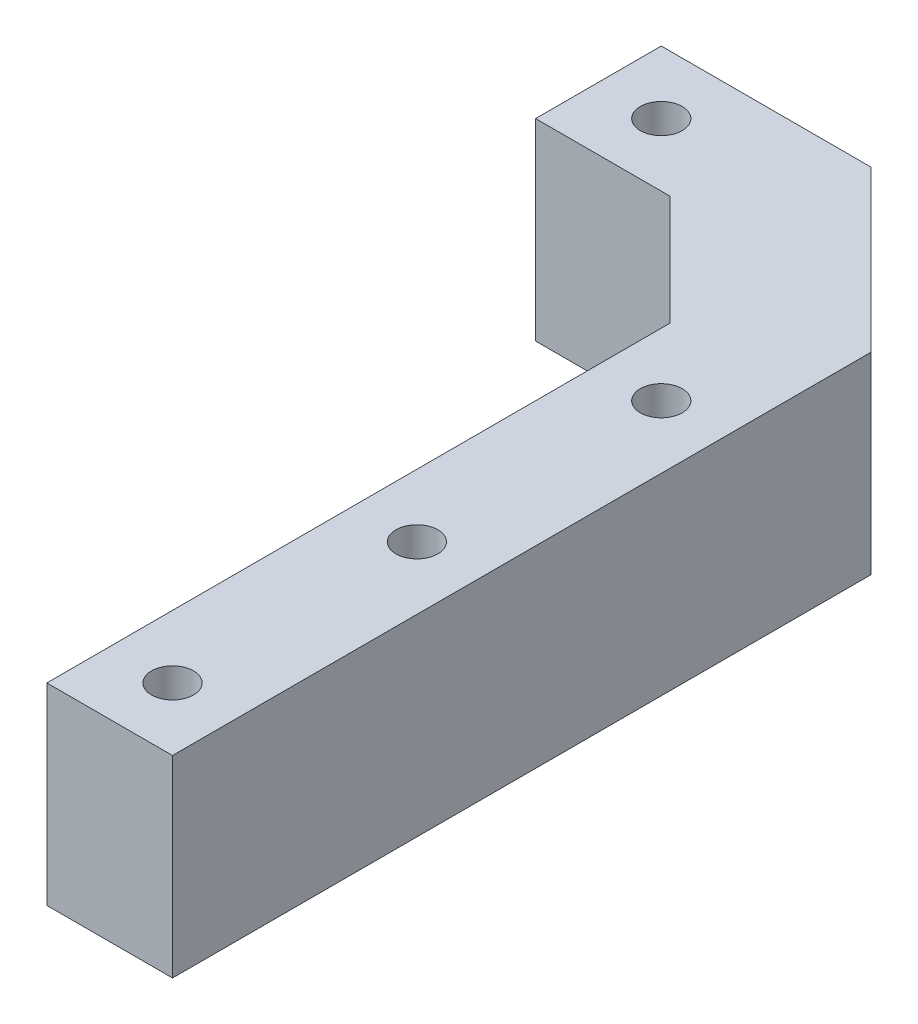
ISO-10303-21;
HEADER;
FILE_DESCRIPTION(('STEP AP214'),'2;1');
FILE_NAME('part.step','',(''),(''),'','','');
FILE_SCHEMA(('AUTOMOTIVE_DESIGN { 1 0 10303 214 1 1 1 1 }'));
ENDSEC;
DATA;
#1=APPLICATION_CONTEXT('core data for automotive mechanical design processes');
#2=APPLICATION_PROTOCOL_DEFINITION('international standard','automotive_design',2000,#1);
#3=PRODUCT_CONTEXT('',#1,'mechanical');
#4=PRODUCT('Part','Part','',(#3));
#5=PRODUCT_RELATED_PRODUCT_CATEGORY('part','',(#4));
#6=PRODUCT_DEFINITION_FORMATION('','',#4);
#7=PRODUCT_DEFINITION_CONTEXT('part definition',#1,'design');
#8=PRODUCT_DEFINITION('design','',#6,#7);
#9=PRODUCT_DEFINITION_SHAPE('','',#8);
#10=(LENGTH_UNIT() NAMED_UNIT(*) SI_UNIT(.MILLI.,.METRE.));
#11=(NAMED_UNIT(*) PLANE_ANGLE_UNIT() SI_UNIT($,.RADIAN.));
#12=(NAMED_UNIT(*) SI_UNIT($,.STERADIAN.) SOLID_ANGLE_UNIT());
#13=UNCERTAINTY_MEASURE_WITH_UNIT(LENGTH_MEASURE(1.E-05),#10,'distance_accuracy_value','');
#14=(GEOMETRIC_REPRESENTATION_CONTEXT(3) GLOBAL_UNCERTAINTY_ASSIGNED_CONTEXT((#13)) GLOBAL_UNIT_ASSIGNED_CONTEXT((#10,
#11,#12)) REPRESENTATION_CONTEXT('',''));
#15=CARTESIAN_POINT('',(0.,0.,0.));
#16=DIRECTION('',(0.,0.,1.));
#17=DIRECTION('',(1.,0.,0.));
#18=AXIS2_PLACEMENT_3D('',#15,#16,#17);
#19=CARTESIAN_POINT('',(0.,13.8,0.));
#20=DIRECTION('',(0.,1.,0.));
#21=DIRECTION('',(0.,0.,1.));
#22=AXIS2_PLACEMENT_3D('',#19,#20,#21);
#23=PLANE('',#22);
#24=CARTESIAN_POINT('',(-17.5,13.8,52.5));
#25=DIRECTION('',(0.,1.,0.));
#26=DIRECTION('',(0.,0.,1.));
#27=AXIS2_PLACEMENT_3D('',#24,#25,#26);
#28=CIRCLE('',#27,1.5);
#29=CARTESIAN_POINT('',(-17.5,13.8,51.));
#30=VERTEX_POINT('',#29);
#31=EDGE_CURVE('E196',#30,#30,#28,.T.);
#32=ORIENTED_EDGE('',*,*,#31,.F.);
#33=EDGE_LOOP('',(#32));
#34=FACE_BOUND('',#33,.T.);
#35=CARTESIAN_POINT('',(-35.,13.8,17.5));
#36=DIRECTION('',(0.,1.,0.));
#37=DIRECTION('',(0.,0.,1.));
#38=AXIS2_PLACEMENT_3D('',#35,#36,#37);
#39=CIRCLE('',#38,1.5);
#40=CARTESIAN_POINT('',(-35.,13.8,16.));
#41=VERTEX_POINT('',#40);
#42=EDGE_CURVE('E142',#41,#41,#39,.T.);
#43=ORIENTED_EDGE('',*,*,#42,.F.);
#44=EDGE_LOOP('',(#43));
#45=FACE_BOUND('',#44,.T.);
#46=DIRECTION('',(-1.,0.,0.));
#47=VECTOR('',#46,1.);
#48=CARTESIAN_POINT('',(-39.5,13.8,13.));
#49=LINE('',#48,#47);
#50=CARTESIAN_POINT('',(-24.4684752531343,13.8,13.));
#51=VERTEX_POINT('',#50);
#52=CARTESIAN_POINT('',(-39.5,13.8,13.));
#53=VERTEX_POINT('',#52);
#54=EDGE_CURVE('E154',#51,#53,#49,.T.);
#55=ORIENTED_EDGE('',*,*,#54,.T.);
#56=DIRECTION('',(0.,0.,1.));
#57=VECTOR('',#56,1.);
#58=CARTESIAN_POINT('',(-39.5,13.8,13.));
#59=LINE('',#58,#57);
#60=CARTESIAN_POINT('',(-39.5,13.8,22.));
#61=VERTEX_POINT('',#60);
#62=EDGE_CURVE('E100',#53,#61,#59,.T.);
#63=ORIENTED_EDGE('',*,*,#62,.T.);
#64=DIRECTION('',(1.,0.,0.));
#65=VECTOR('',#64,1.);
#66=CARTESIAN_POINT('',(-39.5,13.8,22.));
#67=LINE('',#66,#65);
#68=CARTESIAN_POINT('',(-29.8824055414627,13.8,22.));
#69=VERTEX_POINT('',#68);
#70=EDGE_CURVE('E169',#61,#69,#67,.T.);
#71=ORIENTED_EDGE('',*,*,#70,.T.);
#72=DIRECTION('',(0.707106781186547,0.,0.707106781186547));
#73=VECTOR('',#72,1.);
#74=CARTESIAN_POINT('',(-29.8824055414627,13.8,22.));
#75=LINE('',#74,#73);
#76=CARTESIAN_POINT('',(-22.,13.8,29.8824055414627));
#77=VERTEX_POINT('',#76);
#78=EDGE_CURVE('E181',#69,#77,#75,.T.);
#79=ORIENTED_EDGE('',*,*,#78,.T.);
#80=DIRECTION('',(0.,0.,1.));
#81=VECTOR('',#80,1.);
#82=CARTESIAN_POINT('',(-22.,13.8,29.8824055414627));
#83=LINE('',#82,#81);
#84=CARTESIAN_POINT('',(-22.,13.8,74.5));
#85=VERTEX_POINT('',#84);
#86=EDGE_CURVE('E119',#77,#85,#83,.T.);
#87=ORIENTED_EDGE('',*,*,#86,.T.);
#88=DIRECTION('',(1.,0.,0.));
#89=VECTOR('',#88,1.);
#90=CARTESIAN_POINT('',(-22.,13.8,74.5));
#91=LINE('',#90,#89);
#92=CARTESIAN_POINT('',(-13.,13.8,74.5));
#93=VERTEX_POINT('',#92);
#94=EDGE_CURVE('E113',#85,#93,#91,.T.);
#95=ORIENTED_EDGE('',*,*,#94,.T.);
#96=DIRECTION('',(0.,0.,-1.));
#97=VECTOR('',#96,1.);
#98=CARTESIAN_POINT('',(-13.,13.8,74.5));
#99=LINE('',#98,#97);
#100=CARTESIAN_POINT('',(-13.,13.8,24.4684752531343));
#101=VERTEX_POINT('',#100);
#102=EDGE_CURVE('E117',#93,#101,#99,.T.);
#103=ORIENTED_EDGE('',*,*,#102,.T.);
#104=DIRECTION('',(-0.707106781186547,0.,-0.707106781186548));
#105=VECTOR('',#104,1.);
#106=CARTESIAN_POINT('',(-13.,13.8,24.4684752531343));
#107=LINE('',#106,#105);
#108=EDGE_CURVE('E58',#101,#51,#107,.T.);
#109=ORIENTED_EDGE('',*,*,#108,.T.);
#110=EDGE_LOOP('',(#55,#63,#71,#79,#87,#95,#103,#109));
#111=FACE_BOUND('',#110,.T.);
#112=CARTESIAN_POINT('',(-17.5,13.8,35.));
#113=DIRECTION('',(0.,1.,0.));
#114=DIRECTION('',(0.,0.,1.));
#115=AXIS2_PLACEMENT_3D('',#112,#113,#114);
#116=CIRCLE('',#115,1.5);
#117=CARTESIAN_POINT('',(-17.5,13.8,33.5));
#118=VERTEX_POINT('',#117);
#119=EDGE_CURVE('E190',#118,#118,#116,.T.);
#120=ORIENTED_EDGE('',*,*,#119,.F.);
#121=EDGE_LOOP('',(#120));
#122=FACE_BOUND('',#121,.T.);
#123=CARTESIAN_POINT('',(-17.5,13.8,70.));
#124=DIRECTION('',(0.,1.,0.));
#125=DIRECTION('',(0.,0.,1.));
#126=AXIS2_PLACEMENT_3D('',#123,#124,#125);
#127=CIRCLE('',#126,1.5);
#128=CARTESIAN_POINT('',(-17.5,13.8,68.5));
#129=VERTEX_POINT('',#128);
#130=EDGE_CURVE('E202',#129,#129,#127,.T.);
#131=ORIENTED_EDGE('',*,*,#130,.F.);
#132=EDGE_LOOP('',(#131));
#133=FACE_BOUND('',#132,.T.);
#134=ADVANCED_FACE('F41',(#34,#45,#111,#122,#133),#23,.T.);
#135=CARTESIAN_POINT('',(0.,0.,0.));
#136=DIRECTION('',(0.,1.,0.));
#137=DIRECTION('',(0.,0.,1.));
#138=AXIS2_PLACEMENT_3D('',#135,#136,#137);
#139=PLANE('',#138);
#140=DIRECTION('',(-1.,0.,0.));
#141=VECTOR('',#140,1.);
#142=CARTESIAN_POINT('',(-39.5,0.,13.));
#143=LINE('',#142,#141);
#144=CARTESIAN_POINT('',(-24.4684752531343,0.,13.));
#145=VERTEX_POINT('',#144);
#146=CARTESIAN_POINT('',(-39.5,0.,13.));
#147=VERTEX_POINT('',#146);
#148=EDGE_CURVE('E138',#145,#147,#143,.T.);
#149=ORIENTED_EDGE('',*,*,#148,.F.);
#150=DIRECTION('',(-0.707106781186547,0.,-0.707106781186548));
#151=VECTOR('',#150,1.);
#152=CARTESIAN_POINT('',(-13.,0.,24.4684752531343));
#153=LINE('',#152,#151);
#154=CARTESIAN_POINT('',(-13.,0.,24.4684752531343));
#155=VERTEX_POINT('',#154);
#156=EDGE_CURVE('E92',#155,#145,#153,.T.);
#157=ORIENTED_EDGE('',*,*,#156,.F.);
#158=DIRECTION('',(0.,0.,-1.));
#159=VECTOR('',#158,1.);
#160=CARTESIAN_POINT('',(-13.,0.,37.5));
#161=LINE('',#160,#159);
#162=CARTESIAN_POINT('',(-13.,0.,74.5));
#163=VERTEX_POINT('',#162);
#164=EDGE_CURVE('E86',#163,#155,#161,.T.);
#165=ORIENTED_EDGE('',*,*,#164,.F.);
#166=DIRECTION('',(1.,0.,0.));
#167=VECTOR('',#166,1.);
#168=CARTESIAN_POINT('',(-22.,0.,74.5));
#169=LINE('',#168,#167);
#170=CARTESIAN_POINT('',(-22.,0.,74.5));
#171=VERTEX_POINT('',#170);
#172=EDGE_CURVE('E128',#171,#163,#169,.T.);
#173=ORIENTED_EDGE('',*,*,#172,.F.);
#174=DIRECTION('',(0.,0.,1.));
#175=VECTOR('',#174,1.);
#176=CARTESIAN_POINT('',(-22.,0.,37.5));
#177=LINE('',#176,#175);
#178=CARTESIAN_POINT('',(-22.,0.,29.8824055414627));
#179=VERTEX_POINT('',#178);
#180=EDGE_CURVE('E149',#179,#171,#177,.T.);
#181=ORIENTED_EDGE('',*,*,#180,.F.);
#182=DIRECTION('',(0.707106781186547,0.,0.707106781186547));
#183=VECTOR('',#182,1.);
#184=CARTESIAN_POINT('',(-29.8824055414627,0.,22.));
#185=LINE('',#184,#183);
#186=CARTESIAN_POINT('',(-29.8824055414627,0.,22.));
#187=VERTEX_POINT('',#186);
#188=EDGE_CURVE('E146',#187,#179,#185,.T.);
#189=ORIENTED_EDGE('',*,*,#188,.F.);
#190=DIRECTION('',(1.,0.,0.));
#191=VECTOR('',#190,1.);
#192=CARTESIAN_POINT('',(-39.5,0.,22.));
#193=LINE('',#192,#191);
#194=CARTESIAN_POINT('',(-39.5,0.,22.));
#195=VERTEX_POINT('',#194);
#196=EDGE_CURVE('E144',#195,#187,#193,.T.);
#197=ORIENTED_EDGE('',*,*,#196,.F.);
#198=DIRECTION('',(0.,0.,1.));
#199=VECTOR('',#198,1.);
#200=CARTESIAN_POINT('',(-39.5,0.,13.));
#201=LINE('',#200,#199);
#202=EDGE_CURVE('E141',#147,#195,#201,.T.);
#203=ORIENTED_EDGE('',*,*,#202,.F.);
#204=EDGE_LOOP('',(#149,#157,#165,#173,#181,#189,#197,#203));
#205=FACE_BOUND('',#204,.T.);
#206=CARTESIAN_POINT('',(-35.,0.,17.5));
#207=DIRECTION('',(0.,1.,0.));
#208=DIRECTION('',(0.,0.,1.));
#209=AXIS2_PLACEMENT_3D('',#206,#207,#208);
#210=CIRCLE('',#209,1.5);
#211=CARTESIAN_POINT('',(-35.,0.,16.));
#212=VERTEX_POINT('',#211);
#213=EDGE_CURVE('E187',#212,#212,#210,.T.);
#214=ORIENTED_EDGE('',*,*,#213,.T.);
#215=EDGE_LOOP('',(#214));
#216=FACE_BOUND('',#215,.T.);
#217=CARTESIAN_POINT('',(-17.5,0.,35.));
#218=DIRECTION('',(0.,1.,0.));
#219=DIRECTION('',(0.,0.,1.));
#220=AXIS2_PLACEMENT_3D('',#217,#218,#219);
#221=CIRCLE('',#220,1.5);
#222=CARTESIAN_POINT('',(-17.5,0.,33.5));
#223=VERTEX_POINT('',#222);
#224=EDGE_CURVE('E193',#223,#223,#221,.T.);
#225=ORIENTED_EDGE('',*,*,#224,.T.);
#226=EDGE_LOOP('',(#225));
#227=FACE_BOUND('',#226,.T.);
#228=CARTESIAN_POINT('',(-17.5,0.,52.5));
#229=DIRECTION('',(0.,1.,0.));
#230=DIRECTION('',(0.,0.,1.));
#231=AXIS2_PLACEMENT_3D('',#228,#229,#230);
#232=CIRCLE('',#231,1.5);
#233=CARTESIAN_POINT('',(-17.5,0.,51.));
#234=VERTEX_POINT('',#233);
#235=EDGE_CURVE('E199',#234,#234,#232,.T.);
#236=ORIENTED_EDGE('',*,*,#235,.T.);
#237=EDGE_LOOP('',(#236));
#238=FACE_BOUND('',#237,.T.);
#239=CARTESIAN_POINT('',(-17.5,0.,70.));
#240=DIRECTION('',(0.,1.,0.));
#241=DIRECTION('',(0.,0.,1.));
#242=AXIS2_PLACEMENT_3D('',#239,#240,#241);
#243=CIRCLE('',#242,1.5);
#244=CARTESIAN_POINT('',(-17.5,0.,68.5));
#245=VERTEX_POINT('',#244);
#246=EDGE_CURVE('E205',#245,#245,#243,.T.);
#247=ORIENTED_EDGE('',*,*,#246,.T.);
#248=EDGE_LOOP('',(#247));
#249=FACE_BOUND('',#248,.T.);
#250=ADVANCED_FACE('F173',(#205,#216,#227,#238,#249),#139,.F.);
#251=CARTESIAN_POINT('',(-39.5,13.8,13.));
#252=DIRECTION('',(0.,0.,1.));
#253=DIRECTION('',(1.,0.,0.));
#254=AXIS2_PLACEMENT_3D('',#251,#252,#253);
#255=PLANE('',#254);
#256=ORIENTED_EDGE('',*,*,#148,.T.);
#257=DIRECTION('',(0.,-1.,0.));
#258=VECTOR('',#257,1.);
#259=CARTESIAN_POINT('',(-39.5,13.8,13.));
#260=LINE('',#259,#258);
#261=EDGE_CURVE('E11',#53,#147,#260,.T.);
#262=ORIENTED_EDGE('',*,*,#261,.F.);
#263=ORIENTED_EDGE('',*,*,#54,.F.);
#264=DIRECTION('',(0.,-1.,0.));
#265=VECTOR('',#264,1.);
#266=CARTESIAN_POINT('',(-24.4684752531343,13.8,13.));
#267=LINE('',#266,#265);
#268=EDGE_CURVE('E134',#51,#145,#267,.T.);
#269=ORIENTED_EDGE('',*,*,#268,.T.);
#270=EDGE_LOOP('',(#256,#262,#263,#269));
#271=FACE_BOUND('',#270,.T.);
#272=ADVANCED_FACE('F43',(#271),#255,.F.);
#273=CARTESIAN_POINT('',(-39.5,13.8,13.));
#274=DIRECTION('',(1.,0.,0.));
#275=DIRECTION('',(0.,0.,-1.));
#276=AXIS2_PLACEMENT_3D('',#273,#274,#275);
#277=PLANE('',#276);
#278=ORIENTED_EDGE('',*,*,#202,.T.);
#279=DIRECTION('',(0.,-1.,0.));
#280=VECTOR('',#279,1.);
#281=CARTESIAN_POINT('',(-39.5,13.8,22.));
#282=LINE('',#281,#280);
#283=EDGE_CURVE('E50',#61,#195,#282,.T.);
#284=ORIENTED_EDGE('',*,*,#283,.F.);
#285=ORIENTED_EDGE('',*,*,#62,.F.);
#286=ORIENTED_EDGE('',*,*,#261,.T.);
#287=EDGE_LOOP('',(#278,#284,#285,#286));
#288=FACE_BOUND('',#287,.T.);
#289=ADVANCED_FACE('F239',(#288),#277,.F.);
#290=CARTESIAN_POINT('',(-39.5,13.8,22.));
#291=DIRECTION('',(0.,0.,-1.));
#292=DIRECTION('',(-1.,0.,0.));
#293=AXIS2_PLACEMENT_3D('',#290,#291,#292);
#294=PLANE('',#293);
#295=ORIENTED_EDGE('',*,*,#196,.T.);
#296=DIRECTION('',(0.,-1.,0.));
#297=VECTOR('',#296,1.);
#298=CARTESIAN_POINT('',(-29.8824055414627,13.8,22.));
#299=LINE('',#298,#297);
#300=EDGE_CURVE('E161',#69,#187,#299,.T.);
#301=ORIENTED_EDGE('',*,*,#300,.F.);
#302=ORIENTED_EDGE('',*,*,#70,.F.);
#303=ORIENTED_EDGE('',*,*,#283,.T.);
#304=EDGE_LOOP('',(#295,#301,#302,#303));
#305=FACE_BOUND('',#304,.T.);
#306=ADVANCED_FACE('F167',(#305),#294,.F.);
#307=CARTESIAN_POINT('',(-29.8824055414627,13.8,22.));
#308=DIRECTION('',(0.707106781186547,0.,-0.707106781186547));
#309=DIRECTION('',(-0.707106781186548,0.,-0.707106781186548));
#310=AXIS2_PLACEMENT_3D('',#307,#308,#309);
#311=PLANE('',#310);
#312=ORIENTED_EDGE('',*,*,#188,.T.);
#313=DIRECTION('',(0.,-1.,0.));
#314=VECTOR('',#313,1.);
#315=CARTESIAN_POINT('',(-22.,13.8,29.8824055414627));
#316=LINE('',#315,#314);
#317=EDGE_CURVE('E158',#77,#179,#316,.T.);
#318=ORIENTED_EDGE('',*,*,#317,.F.);
#319=ORIENTED_EDGE('',*,*,#78,.F.);
#320=ORIENTED_EDGE('',*,*,#300,.T.);
#321=EDGE_LOOP('',(#312,#318,#319,#320));
#322=FACE_BOUND('',#321,.T.);
#323=ADVANCED_FACE('F177',(#322),#311,.F.);
#324=CARTESIAN_POINT('',(-22.,13.8,37.5));
#325=DIRECTION('',(1.,0.,0.));
#326=DIRECTION('',(0.,0.,-1.));
#327=AXIS2_PLACEMENT_3D('',#324,#325,#326);
#328=PLANE('',#327);
#329=ORIENTED_EDGE('',*,*,#180,.T.);
#330=DIRECTION('',(0.,-1.,0.));
#331=VECTOR('',#330,1.);
#332=CARTESIAN_POINT('',(-22.,13.8,74.5));
#333=LINE('',#332,#331);
#334=EDGE_CURVE('E129',#85,#171,#333,.T.);
#335=ORIENTED_EDGE('',*,*,#334,.F.);
#336=ORIENTED_EDGE('',*,*,#86,.F.);
#337=ORIENTED_EDGE('',*,*,#317,.T.);
#338=EDGE_LOOP('',(#329,#335,#336,#337));
#339=FACE_BOUND('',#338,.T.);
#340=ADVANCED_FACE('F180',(#339),#328,.F.);
#341=CARTESIAN_POINT('',(-22.,13.8,74.5));
#342=DIRECTION('',(0.,0.,-1.));
#343=DIRECTION('',(-1.,0.,0.));
#344=AXIS2_PLACEMENT_3D('',#341,#342,#343);
#345=PLANE('',#344);
#346=ORIENTED_EDGE('',*,*,#172,.T.);
#347=DIRECTION('',(0.,-1.,0.));
#348=VECTOR('',#347,1.);
#349=CARTESIAN_POINT('',(-13.,13.8,74.5));
#350=LINE('',#349,#348);
#351=EDGE_CURVE('E125',#93,#163,#350,.T.);
#352=ORIENTED_EDGE('',*,*,#351,.F.);
#353=ORIENTED_EDGE('',*,*,#94,.F.);
#354=ORIENTED_EDGE('',*,*,#334,.T.);
#355=EDGE_LOOP('',(#346,#352,#353,#354));
#356=FACE_BOUND('',#355,.T.);
#357=ADVANCED_FACE('F126',(#356),#345,.F.);
#358=CARTESIAN_POINT('',(-13.,13.8,37.5));
#359=DIRECTION('',(-1.,0.,0.));
#360=DIRECTION('',(0.,0.,1.));
#361=AXIS2_PLACEMENT_3D('',#358,#359,#360);
#362=PLANE('',#361);
#363=ORIENTED_EDGE('',*,*,#164,.T.);
#364=DIRECTION('',(0.,-1.,0.));
#365=VECTOR('',#364,1.);
#366=CARTESIAN_POINT('',(-13.,13.8,24.4684752531343));
#367=LINE('',#366,#365);
#368=EDGE_CURVE('E130',#101,#155,#367,.T.);
#369=ORIENTED_EDGE('',*,*,#368,.F.);
#370=ORIENTED_EDGE('',*,*,#102,.F.);
#371=ORIENTED_EDGE('',*,*,#351,.T.);
#372=EDGE_LOOP('',(#363,#369,#370,#371));
#373=FACE_BOUND('',#372,.T.);
#374=ADVANCED_FACE('F132',(#373),#362,.F.);
#375=CARTESIAN_POINT('',(-13.,13.8,24.4684752531343));
#376=DIRECTION('',(-0.707106781186548,0.,0.707106781186547));
#377=DIRECTION('',(0.707106781186547,0.,0.707106781186548));
#378=AXIS2_PLACEMENT_3D('',#375,#376,#377);
#379=PLANE('',#378);
#380=ORIENTED_EDGE('',*,*,#156,.T.);
#381=ORIENTED_EDGE('',*,*,#268,.F.);
#382=ORIENTED_EDGE('',*,*,#108,.F.);
#383=ORIENTED_EDGE('',*,*,#368,.T.);
#384=EDGE_LOOP('',(#380,#381,#382,#383));
#385=FACE_BOUND('',#384,.T.);
#386=ADVANCED_FACE('F227',(#385),#379,.F.);
#387=CARTESIAN_POINT('',(-35.,13.8,17.5));
#388=DIRECTION('',(0.,-1.,0.));
#389=DIRECTION('',(0.,0.,-1.));
#390=AXIS2_PLACEMENT_3D('',#387,#388,#389);
#391=CYLINDRICAL_SURFACE('',#390,1.5);
#392=CARTESIAN_POINT('',(-35.,13.8,16.));
#393=CARTESIAN_POINT('',(-35.,13.65625,16.));
#394=CARTESIAN_POINT('',(-35.,13.5125,16.));
#395=CARTESIAN_POINT('',(-35.,13.225,16.));
#396=CARTESIAN_POINT('',(-35.,13.08125,16.));
#397=CARTESIAN_POINT('',(-35.,12.79375,16.));
#398=CARTESIAN_POINT('',(-35.,12.65,16.));
#399=CARTESIAN_POINT('',(-35.,12.3625,16.));
#400=CARTESIAN_POINT('',(-35.,12.21875,16.));
#401=CARTESIAN_POINT('',(-35.,11.93125,16.));
#402=CARTESIAN_POINT('',(-35.,11.7875,16.));
#403=CARTESIAN_POINT('',(-35.,11.5,16.));
#404=CARTESIAN_POINT('',(-35.,11.35625,16.));
#405=CARTESIAN_POINT('',(-35.,11.06875,16.));
#406=CARTESIAN_POINT('',(-35.,10.925,16.));
#407=CARTESIAN_POINT('',(-35.,10.6375,16.));
#408=CARTESIAN_POINT('',(-35.,10.49375,16.));
#409=CARTESIAN_POINT('',(-35.,10.20625,16.));
#410=CARTESIAN_POINT('',(-35.,10.0625,16.));
#411=CARTESIAN_POINT('',(-35.,9.775,16.));
#412=CARTESIAN_POINT('',(-35.,9.63125,16.));
#413=CARTESIAN_POINT('',(-35.,9.34375,16.));
#414=CARTESIAN_POINT('',(-35.,9.2,16.));
#415=CARTESIAN_POINT('',(-35.,8.9125,16.));
#416=CARTESIAN_POINT('',(-35.,8.76875,16.));
#417=CARTESIAN_POINT('',(-35.,8.48125,16.));
#418=CARTESIAN_POINT('',(-35.,8.3375,16.));
#419=CARTESIAN_POINT('',(-35.,8.05,16.));
#420=CARTESIAN_POINT('',(-35.,7.90625,16.));
#421=CARTESIAN_POINT('',(-35.,7.61875,16.));
#422=CARTESIAN_POINT('',(-35.,7.475,16.));
#423=CARTESIAN_POINT('',(-35.,7.1875,16.));
#424=CARTESIAN_POINT('',(-35.,7.04375,16.));
#425=CARTESIAN_POINT('',(-35.,6.75625,16.));
#426=CARTESIAN_POINT('',(-35.,6.6125,16.));
#427=CARTESIAN_POINT('',(-35.,6.325,16.));
#428=CARTESIAN_POINT('',(-35.,6.18125,16.));
#429=CARTESIAN_POINT('',(-35.,5.89375,16.));
#430=CARTESIAN_POINT('',(-35.,5.75,16.));
#431=CARTESIAN_POINT('',(-35.,5.4625,16.));
#432=CARTESIAN_POINT('',(-35.,5.31875,16.));
#433=CARTESIAN_POINT('',(-35.,5.03125,16.));
#434=CARTESIAN_POINT('',(-35.,4.8875,16.));
#435=CARTESIAN_POINT('',(-35.,4.6,16.));
#436=CARTESIAN_POINT('',(-35.,4.45625,16.));
#437=CARTESIAN_POINT('',(-35.,4.16875,16.));
#438=CARTESIAN_POINT('',(-35.,4.025,16.));
#439=CARTESIAN_POINT('',(-35.,3.7375,16.));
#440=CARTESIAN_POINT('',(-35.,3.59375,16.));
#441=CARTESIAN_POINT('',(-35.,3.30625,16.));
#442=CARTESIAN_POINT('',(-35.,3.1625,16.));
#443=CARTESIAN_POINT('',(-35.,2.875,16.));
#444=CARTESIAN_POINT('',(-35.,2.73125,16.));
#445=CARTESIAN_POINT('',(-35.,2.44375,16.));
#446=CARTESIAN_POINT('',(-35.,2.3,16.));
#447=CARTESIAN_POINT('',(-35.,2.0125,16.));
#448=CARTESIAN_POINT('',(-35.,1.86875,16.));
#449=CARTESIAN_POINT('',(-35.,1.58125,16.));
#450=CARTESIAN_POINT('',(-35.,1.4375,16.));
#451=CARTESIAN_POINT('',(-35.,1.15,16.));
#452=CARTESIAN_POINT('',(-35.,1.00625,16.));
#453=CARTESIAN_POINT('',(-35.,0.71875,16.));
#454=CARTESIAN_POINT('',(-35.,0.575,16.));
#455=CARTESIAN_POINT('',(-35.,0.2875,16.));
#456=CARTESIAN_POINT('',(-35.,0.14375,16.));
#457=CARTESIAN_POINT('',(-35.,0.,16.));
#458=B_SPLINE_CURVE_WITH_KNOTS('',3,(#392,#393,#394,#395,#396,#397,#398,#399,#400,#401,#402,
#403,#404,#405,#406,#407,#408,#409,#410,#411,#412,#413,#414,#415,#416,#417,#418,#419,#420,#421,
#422,#423,#424,#425,#426,#427,#428,#429,#430,#431,#432,#433,#434,#435,#436,#437,#438,#439,#440,
#441,#442,#443,#444,#445,#446,#447,#448,#449,#450,#451,#452,#453,#454,#455,#456,#457),
.UNSPECIFIED.,.F.,.F.,(4,2,2,2,2,2,2,2,2,2,2,2,2,2,2,2,2,2,2,2,2,2,2,2,2,2,2,2,2,2,2,2,4),(0.,
0.431249999999999,0.862499999999999,1.29375,1.725,2.15625,2.5875,3.01875,3.45,3.88125,4.3125,
4.74375,5.175,5.60625,6.0375,6.46875,6.9,7.33125,7.7625,8.19375,8.625,9.05625,9.4875,9.91875,
10.35,10.78125,11.2125,11.64375,12.075,12.50625,12.9375,13.36875,13.8),.UNSPECIFIED.);
#459=EDGE_CURVE('BSEAM224',#41,#212,#458,.T.);
#460=ORIENTED_EDGE('',*,*,#42,.T.);
#461=ORIENTED_EDGE('',*,*,#213,.F.);
#462=ORIENTED_EDGE('',*,*,#459,.T.);
#463=ORIENTED_EDGE('',*,*,#459,.F.);
#464=EDGE_LOOP('',(#460,#462,#461,#463));
#465=FACE_BOUND('',#464,.T.);
#466=ADVANCED_FACE('F224',(#465),#391,.F.);
#467=CARTESIAN_POINT('',(-17.5,13.8,35.));
#468=DIRECTION('',(0.,-1.,0.));
#469=DIRECTION('',(0.,0.,-1.));
#470=AXIS2_PLACEMENT_3D('',#467,#468,#469);
#471=CYLINDRICAL_SURFACE('',#470,1.5);
#472=CARTESIAN_POINT('',(-17.5,13.8,33.5));
#473=CARTESIAN_POINT('',(-17.5,13.65625,33.5));
#474=CARTESIAN_POINT('',(-17.5,13.5125,33.5));
#475=CARTESIAN_POINT('',(-17.5,13.225,33.5));
#476=CARTESIAN_POINT('',(-17.5,13.08125,33.5));
#477=CARTESIAN_POINT('',(-17.5,12.79375,33.5));
#478=CARTESIAN_POINT('',(-17.5,12.65,33.5));
#479=CARTESIAN_POINT('',(-17.5,12.3625,33.5));
#480=CARTESIAN_POINT('',(-17.5,12.21875,33.5));
#481=CARTESIAN_POINT('',(-17.5,11.93125,33.5));
#482=CARTESIAN_POINT('',(-17.5,11.7875,33.5));
#483=CARTESIAN_POINT('',(-17.5,11.5,33.5));
#484=CARTESIAN_POINT('',(-17.5,11.35625,33.5));
#485=CARTESIAN_POINT('',(-17.5,11.06875,33.5));
#486=CARTESIAN_POINT('',(-17.5,10.925,33.5));
#487=CARTESIAN_POINT('',(-17.5,10.6375,33.5));
#488=CARTESIAN_POINT('',(-17.5,10.49375,33.5));
#489=CARTESIAN_POINT('',(-17.5,10.20625,33.5));
#490=CARTESIAN_POINT('',(-17.5,10.0625,33.5));
#491=CARTESIAN_POINT('',(-17.5,9.775,33.5));
#492=CARTESIAN_POINT('',(-17.5,9.63125,33.5));
#493=CARTESIAN_POINT('',(-17.5,9.34375,33.5));
#494=CARTESIAN_POINT('',(-17.5,9.2,33.5));
#495=CARTESIAN_POINT('',(-17.5,8.9125,33.5));
#496=CARTESIAN_POINT('',(-17.5,8.76875,33.5));
#497=CARTESIAN_POINT('',(-17.5,8.48125,33.5));
#498=CARTESIAN_POINT('',(-17.5,8.3375,33.5));
#499=CARTESIAN_POINT('',(-17.5,8.05,33.5));
#500=CARTESIAN_POINT('',(-17.5,7.90625,33.5));
#501=CARTESIAN_POINT('',(-17.5,7.61875,33.5));
#502=CARTESIAN_POINT('',(-17.5,7.475,33.5));
#503=CARTESIAN_POINT('',(-17.5,7.1875,33.5));
#504=CARTESIAN_POINT('',(-17.5,7.04375,33.5));
#505=CARTESIAN_POINT('',(-17.5,6.75625,33.5));
#506=CARTESIAN_POINT('',(-17.5,6.6125,33.5));
#507=CARTESIAN_POINT('',(-17.5,6.325,33.5));
#508=CARTESIAN_POINT('',(-17.5,6.18125,33.5));
#509=CARTESIAN_POINT('',(-17.5,5.89375,33.5));
#510=CARTESIAN_POINT('',(-17.5,5.75,33.5));
#511=CARTESIAN_POINT('',(-17.5,5.4625,33.5));
#512=CARTESIAN_POINT('',(-17.5,5.31875,33.5));
#513=CARTESIAN_POINT('',(-17.5,5.03125,33.5));
#514=CARTESIAN_POINT('',(-17.5,4.8875,33.5));
#515=CARTESIAN_POINT('',(-17.5,4.6,33.5));
#516=CARTESIAN_POINT('',(-17.5,4.45625,33.5));
#517=CARTESIAN_POINT('',(-17.5,4.16875,33.5));
#518=CARTESIAN_POINT('',(-17.5,4.025,33.5));
#519=CARTESIAN_POINT('',(-17.5,3.7375,33.5));
#520=CARTESIAN_POINT('',(-17.5,3.59375,33.5));
#521=CARTESIAN_POINT('',(-17.5,3.30625,33.5));
#522=CARTESIAN_POINT('',(-17.5,3.1625,33.5));
#523=CARTESIAN_POINT('',(-17.5,2.875,33.5));
#524=CARTESIAN_POINT('',(-17.5,2.73125,33.5));
#525=CARTESIAN_POINT('',(-17.5,2.44375,33.5));
#526=CARTESIAN_POINT('',(-17.5,2.3,33.5));
#527=CARTESIAN_POINT('',(-17.5,2.0125,33.5));
#528=CARTESIAN_POINT('',(-17.5,1.86875,33.5));
#529=CARTESIAN_POINT('',(-17.5,1.58125,33.5));
#530=CARTESIAN_POINT('',(-17.5,1.4375,33.5));
#531=CARTESIAN_POINT('',(-17.5,1.15,33.5));
#532=CARTESIAN_POINT('',(-17.5,1.00625,33.5));
#533=CARTESIAN_POINT('',(-17.5,0.71875,33.5));
#534=CARTESIAN_POINT('',(-17.5,0.575,33.5));
#535=CARTESIAN_POINT('',(-17.5,0.2875,33.5));
#536=CARTESIAN_POINT('',(-17.5,0.14375,33.5));
#537=CARTESIAN_POINT('',(-17.5,0.,33.5));
#538=B_SPLINE_CURVE_WITH_KNOTS('',3,(#472,#473,#474,#475,#476,#477,#478,#479,#480,#481,#482,
#483,#484,#485,#486,#487,#488,#489,#490,#491,#492,#493,#494,#495,#496,#497,#498,#499,#500,#501,
#502,#503,#504,#505,#506,#507,#508,#509,#510,#511,#512,#513,#514,#515,#516,#517,#518,#519,#520,
#521,#522,#523,#524,#525,#526,#527,#528,#529,#530,#531,#532,#533,#534,#535,#536,#537),
.UNSPECIFIED.,.F.,.F.,(4,2,2,2,2,2,2,2,2,2,2,2,2,2,2,2,2,2,2,2,2,2,2,2,2,2,2,2,2,2,2,2,4),(0.,
0.431249999999999,0.862499999999999,1.29375,1.725,2.15625,2.5875,3.01875,3.45,3.88125,4.3125,
4.74375,5.175,5.60625,6.0375,6.46875,6.9,7.33125,7.7625,8.19375,8.625,9.05625,9.4875,9.91875,
10.35,10.78125,11.2125,11.64375,12.075,12.50625,12.9375,13.36875,13.8),.UNSPECIFIED.);
#539=EDGE_CURVE('BSEAM304',#118,#223,#538,.T.);
#540=ORIENTED_EDGE('',*,*,#119,.T.);
#541=ORIENTED_EDGE('',*,*,#224,.F.);
#542=ORIENTED_EDGE('',*,*,#539,.T.);
#543=ORIENTED_EDGE('',*,*,#539,.F.);
#544=EDGE_LOOP('',(#540,#542,#541,#543));
#545=FACE_BOUND('',#544,.T.);
#546=ADVANCED_FACE('F304',(#545),#471,.F.);
#547=CARTESIAN_POINT('',(-17.5,13.8,52.5));
#548=DIRECTION('',(0.,-1.,0.));
#549=DIRECTION('',(0.,0.,-1.));
#550=AXIS2_PLACEMENT_3D('',#547,#548,#549);
#551=CYLINDRICAL_SURFACE('',#550,1.5);
#552=CARTESIAN_POINT('',(-17.5,13.8,51.));
#553=CARTESIAN_POINT('',(-17.5,13.65625,51.));
#554=CARTESIAN_POINT('',(-17.5,13.5125,51.));
#555=CARTESIAN_POINT('',(-17.5,13.225,51.));
#556=CARTESIAN_POINT('',(-17.5,13.08125,51.));
#557=CARTESIAN_POINT('',(-17.5,12.79375,51.));
#558=CARTESIAN_POINT('',(-17.5,12.65,51.));
#559=CARTESIAN_POINT('',(-17.5,12.3625,51.));
#560=CARTESIAN_POINT('',(-17.5,12.21875,51.));
#561=CARTESIAN_POINT('',(-17.5,11.93125,51.));
#562=CARTESIAN_POINT('',(-17.5,11.7875,51.));
#563=CARTESIAN_POINT('',(-17.5,11.5,51.));
#564=CARTESIAN_POINT('',(-17.5,11.35625,51.));
#565=CARTESIAN_POINT('',(-17.5,11.06875,51.));
#566=CARTESIAN_POINT('',(-17.5,10.925,51.));
#567=CARTESIAN_POINT('',(-17.5,10.6375,51.));
#568=CARTESIAN_POINT('',(-17.5,10.49375,51.));
#569=CARTESIAN_POINT('',(-17.5,10.20625,51.));
#570=CARTESIAN_POINT('',(-17.5,10.0625,51.));
#571=CARTESIAN_POINT('',(-17.5,9.775,51.));
#572=CARTESIAN_POINT('',(-17.5,9.63125,51.));
#573=CARTESIAN_POINT('',(-17.5,9.34375,51.));
#574=CARTESIAN_POINT('',(-17.5,9.2,51.));
#575=CARTESIAN_POINT('',(-17.5,8.9125,51.));
#576=CARTESIAN_POINT('',(-17.5,8.76875,51.));
#577=CARTESIAN_POINT('',(-17.5,8.48125,51.));
#578=CARTESIAN_POINT('',(-17.5,8.3375,51.));
#579=CARTESIAN_POINT('',(-17.5,8.05,51.));
#580=CARTESIAN_POINT('',(-17.5,7.90625,51.));
#581=CARTESIAN_POINT('',(-17.5,7.61875,51.));
#582=CARTESIAN_POINT('',(-17.5,7.475,51.));
#583=CARTESIAN_POINT('',(-17.5,7.1875,51.));
#584=CARTESIAN_POINT('',(-17.5,7.04375,51.));
#585=CARTESIAN_POINT('',(-17.5,6.75625,51.));
#586=CARTESIAN_POINT('',(-17.5,6.6125,51.));
#587=CARTESIAN_POINT('',(-17.5,6.325,51.));
#588=CARTESIAN_POINT('',(-17.5,6.18125,51.));
#589=CARTESIAN_POINT('',(-17.5,5.89375,51.));
#590=CARTESIAN_POINT('',(-17.5,5.75,51.));
#591=CARTESIAN_POINT('',(-17.5,5.4625,51.));
#592=CARTESIAN_POINT('',(-17.5,5.31875,51.));
#593=CARTESIAN_POINT('',(-17.5,5.03125,51.));
#594=CARTESIAN_POINT('',(-17.5,4.8875,51.));
#595=CARTESIAN_POINT('',(-17.5,4.6,51.));
#596=CARTESIAN_POINT('',(-17.5,4.45625,51.));
#597=CARTESIAN_POINT('',(-17.5,4.16875,51.));
#598=CARTESIAN_POINT('',(-17.5,4.025,51.));
#599=CARTESIAN_POINT('',(-17.5,3.7375,51.));
#600=CARTESIAN_POINT('',(-17.5,3.59375,51.));
#601=CARTESIAN_POINT('',(-17.5,3.30625,51.));
#602=CARTESIAN_POINT('',(-17.5,3.1625,51.));
#603=CARTESIAN_POINT('',(-17.5,2.875,51.));
#604=CARTESIAN_POINT('',(-17.5,2.73125,51.));
#605=CARTESIAN_POINT('',(-17.5,2.44375,51.));
#606=CARTESIAN_POINT('',(-17.5,2.3,51.));
#607=CARTESIAN_POINT('',(-17.5,2.0125,51.));
#608=CARTESIAN_POINT('',(-17.5,1.86875,51.));
#609=CARTESIAN_POINT('',(-17.5,1.58125,51.));
#610=CARTESIAN_POINT('',(-17.5,1.4375,51.));
#611=CARTESIAN_POINT('',(-17.5,1.15,51.));
#612=CARTESIAN_POINT('',(-17.5,1.00625,51.));
#613=CARTESIAN_POINT('',(-17.5,0.71875,51.));
#614=CARTESIAN_POINT('',(-17.5,0.575,51.));
#615=CARTESIAN_POINT('',(-17.5,0.2875,51.));
#616=CARTESIAN_POINT('',(-17.5,0.14375,51.));
#617=CARTESIAN_POINT('',(-17.5,0.,51.));
#618=B_SPLINE_CURVE_WITH_KNOTS('',3,(#552,#553,#554,#555,#556,#557,#558,#559,#560,#561,#562,
#563,#564,#565,#566,#567,#568,#569,#570,#571,#572,#573,#574,#575,#576,#577,#578,#579,#580,#581,
#582,#583,#584,#585,#586,#587,#588,#589,#590,#591,#592,#593,#594,#595,#596,#597,#598,#599,#600,
#601,#602,#603,#604,#605,#606,#607,#608,#609,#610,#611,#612,#613,#614,#615,#616,#617),
.UNSPECIFIED.,.F.,.F.,(4,2,2,2,2,2,2,2,2,2,2,2,2,2,2,2,2,2,2,2,2,2,2,2,2,2,2,2,2,2,2,2,4),(0.,
0.431249999999999,0.862499999999999,1.29375,1.725,2.15625,2.5875,3.01875,3.45,3.88125,4.3125,
4.74375,5.175,5.60625,6.0375,6.46875,6.9,7.33125,7.7625,8.19375,8.625,9.05625,9.4875,9.91875,
10.35,10.78125,11.2125,11.64375,12.075,12.50625,12.9375,13.36875,13.8),.UNSPECIFIED.);
#619=EDGE_CURVE('BSEAM312',#30,#234,#618,.T.);
#620=ORIENTED_EDGE('',*,*,#31,.T.);
#621=ORIENTED_EDGE('',*,*,#235,.F.);
#622=ORIENTED_EDGE('',*,*,#619,.T.);
#623=ORIENTED_EDGE('',*,*,#619,.F.);
#624=EDGE_LOOP('',(#620,#622,#621,#623));
#625=FACE_BOUND('',#624,.T.);
#626=ADVANCED_FACE('F312',(#625),#551,.F.);
#627=CARTESIAN_POINT('',(-17.5,13.8,70.));
#628=DIRECTION('',(0.,-1.,0.));
#629=DIRECTION('',(0.,0.,-1.));
#630=AXIS2_PLACEMENT_3D('',#627,#628,#629);
#631=CYLINDRICAL_SURFACE('',#630,1.5);
#632=CARTESIAN_POINT('',(-17.5,13.8,68.5));
#633=CARTESIAN_POINT('',(-17.5,13.65625,68.5));
#634=CARTESIAN_POINT('',(-17.5,13.5125,68.5));
#635=CARTESIAN_POINT('',(-17.5,13.225,68.5));
#636=CARTESIAN_POINT('',(-17.5,13.08125,68.5));
#637=CARTESIAN_POINT('',(-17.5,12.79375,68.5));
#638=CARTESIAN_POINT('',(-17.5,12.65,68.5));
#639=CARTESIAN_POINT('',(-17.5,12.3625,68.5));
#640=CARTESIAN_POINT('',(-17.5,12.21875,68.5));
#641=CARTESIAN_POINT('',(-17.5,11.93125,68.5));
#642=CARTESIAN_POINT('',(-17.5,11.7875,68.5));
#643=CARTESIAN_POINT('',(-17.5,11.5,68.5));
#644=CARTESIAN_POINT('',(-17.5,11.35625,68.5));
#645=CARTESIAN_POINT('',(-17.5,11.06875,68.5));
#646=CARTESIAN_POINT('',(-17.5,10.925,68.5));
#647=CARTESIAN_POINT('',(-17.5,10.6375,68.5));
#648=CARTESIAN_POINT('',(-17.5,10.49375,68.5));
#649=CARTESIAN_POINT('',(-17.5,10.20625,68.5));
#650=CARTESIAN_POINT('',(-17.5,10.0625,68.5));
#651=CARTESIAN_POINT('',(-17.5,9.775,68.5));
#652=CARTESIAN_POINT('',(-17.5,9.63125,68.5));
#653=CARTESIAN_POINT('',(-17.5,9.34375,68.5));
#654=CARTESIAN_POINT('',(-17.5,9.2,68.5));
#655=CARTESIAN_POINT('',(-17.5,8.9125,68.5));
#656=CARTESIAN_POINT('',(-17.5,8.76875,68.5));
#657=CARTESIAN_POINT('',(-17.5,8.48125,68.5));
#658=CARTESIAN_POINT('',(-17.5,8.3375,68.5));
#659=CARTESIAN_POINT('',(-17.5,8.05,68.5));
#660=CARTESIAN_POINT('',(-17.5,7.90625,68.5));
#661=CARTESIAN_POINT('',(-17.5,7.61875,68.5));
#662=CARTESIAN_POINT('',(-17.5,7.475,68.5));
#663=CARTESIAN_POINT('',(-17.5,7.1875,68.5));
#664=CARTESIAN_POINT('',(-17.5,7.04375,68.5));
#665=CARTESIAN_POINT('',(-17.5,6.75625,68.5));
#666=CARTESIAN_POINT('',(-17.5,6.6125,68.5));
#667=CARTESIAN_POINT('',(-17.5,6.325,68.5));
#668=CARTESIAN_POINT('',(-17.5,6.18125,68.5));
#669=CARTESIAN_POINT('',(-17.5,5.89375,68.5));
#670=CARTESIAN_POINT('',(-17.5,5.75,68.5));
#671=CARTESIAN_POINT('',(-17.5,5.4625,68.5));
#672=CARTESIAN_POINT('',(-17.5,5.31875,68.5));
#673=CARTESIAN_POINT('',(-17.5,5.03125,68.5));
#674=CARTESIAN_POINT('',(-17.5,4.8875,68.5));
#675=CARTESIAN_POINT('',(-17.5,4.6,68.5));
#676=CARTESIAN_POINT('',(-17.5,4.45625,68.5));
#677=CARTESIAN_POINT('',(-17.5,4.16875,68.5));
#678=CARTESIAN_POINT('',(-17.5,4.025,68.5));
#679=CARTESIAN_POINT('',(-17.5,3.7375,68.5));
#680=CARTESIAN_POINT('',(-17.5,3.59375,68.5));
#681=CARTESIAN_POINT('',(-17.5,3.30625,68.5));
#682=CARTESIAN_POINT('',(-17.5,3.1625,68.5));
#683=CARTESIAN_POINT('',(-17.5,2.875,68.5));
#684=CARTESIAN_POINT('',(-17.5,2.73125,68.5));
#685=CARTESIAN_POINT('',(-17.5,2.44375,68.5));
#686=CARTESIAN_POINT('',(-17.5,2.3,68.5));
#687=CARTESIAN_POINT('',(-17.5,2.0125,68.5));
#688=CARTESIAN_POINT('',(-17.5,1.86875,68.5));
#689=CARTESIAN_POINT('',(-17.5,1.58125,68.5));
#690=CARTESIAN_POINT('',(-17.5,1.4375,68.5));
#691=CARTESIAN_POINT('',(-17.5,1.15,68.5));
#692=CARTESIAN_POINT('',(-17.5,1.00625,68.5));
#693=CARTESIAN_POINT('',(-17.5,0.71875,68.5));
#694=CARTESIAN_POINT('',(-17.5,0.575,68.5));
#695=CARTESIAN_POINT('',(-17.5,0.2875,68.5));
#696=CARTESIAN_POINT('',(-17.5,0.14375,68.5));
#697=CARTESIAN_POINT('',(-17.5,0.,68.5));
#698=B_SPLINE_CURVE_WITH_KNOTS('',3,(#632,#633,#634,#635,#636,#637,#638,#639,#640,#641,#642,
#643,#644,#645,#646,#647,#648,#649,#650,#651,#652,#653,#654,#655,#656,#657,#658,#659,#660,#661,
#662,#663,#664,#665,#666,#667,#668,#669,#670,#671,#672,#673,#674,#675,#676,#677,#678,#679,#680,
#681,#682,#683,#684,#685,#686,#687,#688,#689,#690,#691,#692,#693,#694,#695,#696,#697),
.UNSPECIFIED.,.F.,.F.,(4,2,2,2,2,2,2,2,2,2,2,2,2,2,2,2,2,2,2,2,2,2,2,2,2,2,2,2,2,2,2,2,4),(0.,
0.431249999999999,0.862499999999999,1.29375,1.725,2.15625,2.5875,3.01875,3.45,3.88125,4.3125,
4.74375,5.175,5.60625,6.0375,6.46875,6.9,7.33125,7.7625,8.19375,8.625,9.05625,9.4875,9.91875,
10.35,10.78125,11.2125,11.64375,12.075,12.50625,12.9375,13.36875,13.8),.UNSPECIFIED.);
#699=EDGE_CURVE('BSEAM211',#129,#245,#698,.T.);
#700=ORIENTED_EDGE('',*,*,#130,.T.);
#701=ORIENTED_EDGE('',*,*,#246,.F.);
#702=ORIENTED_EDGE('',*,*,#699,.T.);
#703=ORIENTED_EDGE('',*,*,#699,.F.);
#704=EDGE_LOOP('',(#700,#702,#701,#703));
#705=FACE_BOUND('',#704,.T.);
#706=ADVANCED_FACE('F211',(#705),#631,.F.);
#707=CLOSED_SHELL('',(#134,#250,#272,#289,#306,#323,#340,#357,#374,#386,#466,#546,#626,#706));
#708=MANIFOLD_SOLID_BREP('B2',#707);
#709=ADVANCED_BREP_SHAPE_REPRESENTATION('',(#18,#708),#14);
#710=SHAPE_DEFINITION_REPRESENTATION(#9,#709);
ENDSEC;
END-ISO-10303-21;
